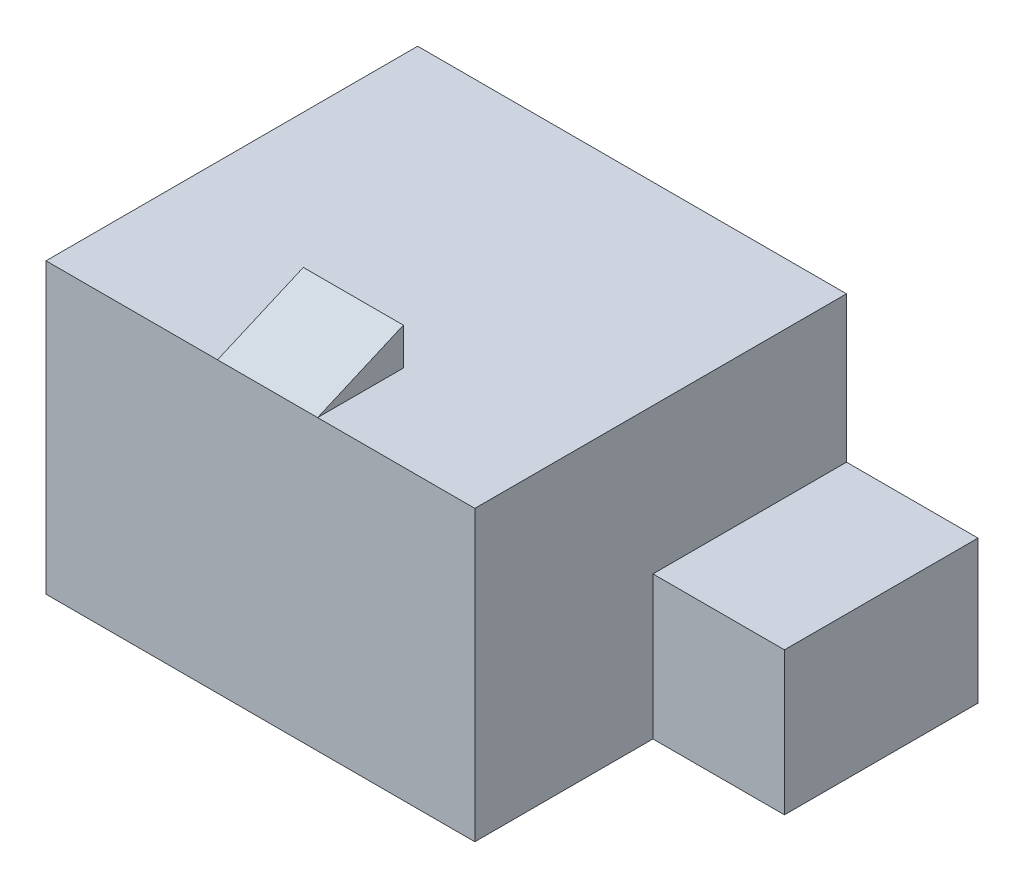
ISO-10303-21;
HEADER;
FILE_DESCRIPTION(('STEP AP214'),'2;1');
FILE_NAME('part.step','',(''),(''),'','','');
FILE_SCHEMA(('AUTOMOTIVE_DESIGN { 1 0 10303 214 1 1 1 1 }'));
ENDSEC;
DATA;
#1=APPLICATION_CONTEXT('core data for automotive mechanical design processes');
#2=APPLICATION_PROTOCOL_DEFINITION('international standard','automotive_design',2000,#1);
#3=PRODUCT_CONTEXT('',#1,'mechanical');
#4=PRODUCT('Part','Part','',(#3));
#5=PRODUCT_RELATED_PRODUCT_CATEGORY('part','',(#4));
#6=PRODUCT_DEFINITION_FORMATION('','',#4);
#7=PRODUCT_DEFINITION_CONTEXT('part definition',#1,'design');
#8=PRODUCT_DEFINITION('design','',#6,#7);
#9=PRODUCT_DEFINITION_SHAPE('','',#8);
#10=(LENGTH_UNIT() NAMED_UNIT(*) SI_UNIT(.MILLI.,.METRE.));
#11=(NAMED_UNIT(*) PLANE_ANGLE_UNIT() SI_UNIT($,.RADIAN.));
#12=(NAMED_UNIT(*) SI_UNIT($,.STERADIAN.) SOLID_ANGLE_UNIT());
#13=UNCERTAINTY_MEASURE_WITH_UNIT(LENGTH_MEASURE(1.E-05),#10,'distance_accuracy_value','');
#14=(GEOMETRIC_REPRESENTATION_CONTEXT(3) GLOBAL_UNCERTAINTY_ASSIGNED_CONTEXT((#13)) GLOBAL_UNIT_ASSIGNED_CONTEXT((#10,
#11,#12)) REPRESENTATION_CONTEXT('',''));
#15=CARTESIAN_POINT('',(0.,0.,0.));
#16=DIRECTION('',(0.,0.,1.));
#17=DIRECTION('',(1.,0.,0.));
#18=AXIS2_PLACEMENT_3D('',#15,#16,#17);
#19=CARTESIAN_POINT('',(0.,10.1,0.));
#20=DIRECTION('',(1.,0.,0.));
#21=DIRECTION('',(0.,0.,-1.));
#22=AXIS2_PLACEMENT_3D('',#19,#20,#21);
#23=PLANE('',#22);
#24=DIRECTION('',(0.,0.,-1.));
#25=VECTOR('',#24,1.);
#26=CARTESIAN_POINT('',(0.,5.,-6.23));
#27=LINE('',#26,#25);
#28=CARTESIAN_POINT('',(0.,5.,-6.23));
#29=VERTEX_POINT('',#28);
#30=CARTESIAN_POINT('',(0.,5.,-13.));
#31=VERTEX_POINT('',#30);
#32=EDGE_CURVE('E157',#29,#31,#27,.T.);
#33=ORIENTED_EDGE('',*,*,#32,.F.);
#34=DIRECTION('',(0.,1.,0.));
#35=VECTOR('',#34,1.);
#36=CARTESIAN_POINT('',(0.,5.,-6.23));
#37=LINE('',#36,#35);
#38=CARTESIAN_POINT('',(0.,0.,-6.23));
#39=VERTEX_POINT('',#38);
#40=EDGE_CURVE('E55',#39,#29,#37,.T.);
#41=ORIENTED_EDGE('',*,*,#40,.F.);
#42=DIRECTION('',(0.,0.,1.));
#43=VECTOR('',#42,1.);
#44=CARTESIAN_POINT('',(0.,0.,0.));
#45=LINE('',#44,#43);
#46=CARTESIAN_POINT('',(0.,0.,0.));
#47=VERTEX_POINT('',#46);
#48=EDGE_CURVE('E187',#39,#47,#45,.T.);
#49=ORIENTED_EDGE('',*,*,#48,.T.);
#50=DIRECTION('',(0.,-1.,0.));
#51=VECTOR('',#50,1.);
#52=CARTESIAN_POINT('',(0.,10.1,0.));
#53=LINE('',#52,#51);
#54=CARTESIAN_POINT('',(0.,10.1,0.));
#55=VERTEX_POINT('',#54);
#56=EDGE_CURVE('E11',#55,#47,#53,.T.);
#57=ORIENTED_EDGE('',*,*,#56,.F.);
#58=DIRECTION('',(0.,0.,1.));
#59=VECTOR('',#58,1.);
#60=CARTESIAN_POINT('',(0.,10.1,0.));
#61=LINE('',#60,#59);
#62=CARTESIAN_POINT('',(0.,10.1,-13.));
#63=VERTEX_POINT('',#62);
#64=EDGE_CURVE('E141',#63,#55,#61,.T.);
#65=ORIENTED_EDGE('',*,*,#64,.F.);
#66=DIRECTION('',(0.,-1.,0.));
#67=VECTOR('',#66,1.);
#68=CARTESIAN_POINT('',(0.,10.1,-13.));
#69=LINE('',#68,#67);
#70=EDGE_CURVE('E49',#63,#31,#69,.T.);
#71=ORIENTED_EDGE('',*,*,#70,.T.);
#72=EDGE_LOOP('',(#33,#41,#49,#57,#65,#71));
#73=FACE_BOUND('',#72,.T.);
#74=ADVANCED_FACE('F33',(#73),#23,.F.);
#75=CARTESIAN_POINT('',(15.,10.1,0.));
#76=DIRECTION('',(-1.,0.,0.));
#77=DIRECTION('',(0.,0.,1.));
#78=AXIS2_PLACEMENT_3D('',#75,#76,#77);
#79=PLANE('',#78);
#80=DIRECTION('',(0.,-1.,0.));
#81=VECTOR('',#80,1.);
#82=CARTESIAN_POINT('',(15.,0.,-6.23));
#83=LINE('',#82,#81);
#84=CARTESIAN_POINT('',(15.,5.,-6.23));
#85=VERTEX_POINT('',#84);
#86=CARTESIAN_POINT('',(15.,0.,-6.23));
#87=VERTEX_POINT('',#86);
#88=EDGE_CURVE('E177',#85,#87,#83,.T.);
#89=ORIENTED_EDGE('',*,*,#88,.F.);
#90=DIRECTION('',(0.,0.,1.));
#91=VECTOR('',#90,1.);
#92=CARTESIAN_POINT('',(15.,5.,-13.));
#93=LINE('',#92,#91);
#94=CARTESIAN_POINT('',(15.,5.,-13.));
#95=VERTEX_POINT('',#94);
#96=EDGE_CURVE('E174',#95,#85,#93,.T.);
#97=ORIENTED_EDGE('',*,*,#96,.F.);
#98=DIRECTION('',(0.,-1.,0.));
#99=VECTOR('',#98,1.);
#100=CARTESIAN_POINT('',(15.,10.1,-13.));
#101=LINE('',#100,#99);
#102=CARTESIAN_POINT('',(15.,10.1,-13.));
#103=VERTEX_POINT('',#102);
#104=EDGE_CURVE('E185',#103,#95,#101,.T.);
#105=ORIENTED_EDGE('',*,*,#104,.F.);
#106=DIRECTION('',(0.,0.,-1.));
#107=VECTOR('',#106,1.);
#108=CARTESIAN_POINT('',(15.,10.1,0.));
#109=LINE('',#108,#107);
#110=CARTESIAN_POINT('',(15.,10.1,0.));
#111=VERTEX_POINT('',#110);
#112=EDGE_CURVE('E270',#111,#103,#109,.T.);
#113=ORIENTED_EDGE('',*,*,#112,.F.);
#114=DIRECTION('',(0.,-1.,0.));
#115=VECTOR('',#114,1.);
#116=CARTESIAN_POINT('',(15.,10.1,0.));
#117=LINE('',#116,#115);
#118=CARTESIAN_POINT('',(15.,0.,0.));
#119=VERTEX_POINT('',#118);
#120=EDGE_CURVE('E41',#111,#119,#117,.T.);
#121=ORIENTED_EDGE('',*,*,#120,.T.);
#122=DIRECTION('',(0.,0.,-1.));
#123=VECTOR('',#122,1.);
#124=CARTESIAN_POINT('',(15.,0.,0.));
#125=LINE('',#124,#123);
#126=EDGE_CURVE('E142',#119,#87,#125,.T.);
#127=ORIENTED_EDGE('',*,*,#126,.T.);
#128=EDGE_LOOP('',(#89,#97,#105,#113,#121,#127));
#129=FACE_BOUND('',#128,.T.);
#130=ADVANCED_FACE('F290',(#129),#79,.F.);
#131=CARTESIAN_POINT('',(0.,10.1,0.));
#132=DIRECTION('',(0.,-1.,0.));
#133=DIRECTION('',(0.,0.,-1.));
#134=AXIS2_PLACEMENT_3D('',#131,#132,#133);
#135=PLANE('',#134);
#136=DIRECTION('',(0.,0.,1.));
#137=VECTOR('',#136,1.);
#138=CARTESIAN_POINT('',(6.,10.1,-3.));
#139=LINE('',#138,#137);
#140=CARTESIAN_POINT('',(6.,10.1,-3.));
#141=VERTEX_POINT('',#140);
#142=CARTESIAN_POINT('',(6.,10.1,0.));
#143=VERTEX_POINT('',#142);
#144=EDGE_CURVE('E226',#141,#143,#139,.T.);
#145=ORIENTED_EDGE('',*,*,#144,.F.);
#146=DIRECTION('',(-1.,0.,0.));
#147=VECTOR('',#146,1.);
#148=CARTESIAN_POINT('',(6.,10.1,-3.));
#149=LINE('',#148,#147);
#150=CARTESIAN_POINT('',(9.5,10.1,-3.));
#151=VERTEX_POINT('',#150);
#152=EDGE_CURVE('E232',#151,#141,#149,.T.);
#153=ORIENTED_EDGE('',*,*,#152,.F.);
#154=DIRECTION('',(0.,0.,-1.));
#155=VECTOR('',#154,1.);
#156=CARTESIAN_POINT('',(9.5,10.1,-3.));
#157=LINE('',#156,#155);
#158=CARTESIAN_POINT('',(9.5,10.1,0.));
#159=VERTEX_POINT('',#158);
#160=EDGE_CURVE('E240',#159,#151,#157,.T.);
#161=ORIENTED_EDGE('',*,*,#160,.F.);
#162=DIRECTION('',(1.,0.,0.));
#163=VECTOR('',#162,1.);
#164=CARTESIAN_POINT('',(0.,10.1,0.));
#165=LINE('',#164,#163);
#166=EDGE_CURVE('E267',#159,#111,#165,.T.);
#167=ORIENTED_EDGE('',*,*,#166,.T.);
#168=ORIENTED_EDGE('',*,*,#112,.T.);
#169=DIRECTION('',(-1.,0.,0.));
#170=VECTOR('',#169,1.);
#171=CARTESIAN_POINT('',(0.,10.1,-13.));
#172=LINE('',#171,#170);
#173=EDGE_CURVE('E186',#103,#63,#172,.T.);
#174=ORIENTED_EDGE('',*,*,#173,.T.);
#175=ORIENTED_EDGE('',*,*,#64,.T.);
#176=EDGE_CURVE('E275',#55,#143,#165,.T.);
#177=ORIENTED_EDGE('',*,*,#176,.T.);
#178=EDGE_LOOP('',(#145,#153,#161,#167,#168,#174,#175,#177));
#179=FACE_BOUND('',#178,.T.);
#180=ADVANCED_FACE('F280',(#179),#135,.F.);
#181=CARTESIAN_POINT('',(0.,10.1,0.));
#182=DIRECTION('',(0.,0.,-1.));
#183=DIRECTION('',(-1.,0.,0.));
#184=AXIS2_PLACEMENT_3D('',#181,#182,#183);
#185=PLANE('',#184);
#186=ORIENTED_EDGE('',*,*,#166,.F.);
#187=DIRECTION('',(1.,0.,0.));
#188=VECTOR('',#187,1.);
#189=CARTESIAN_POINT('',(-0.00102499999999998,10.1,0.));
#190=LINE('',#189,#188);
#191=EDGE_CURVE('E222',#143,#159,#190,.T.);
#192=ORIENTED_EDGE('',*,*,#191,.F.);
#193=ORIENTED_EDGE('',*,*,#176,.F.);
#194=ORIENTED_EDGE('',*,*,#56,.T.);
#195=DIRECTION('',(1.,0.,0.));
#196=VECTOR('',#195,1.);
#197=CARTESIAN_POINT('',(0.,0.,0.));
#198=LINE('',#197,#196);
#199=EDGE_CURVE('E287',#47,#119,#198,.T.);
#200=ORIENTED_EDGE('',*,*,#199,.T.);
#201=ORIENTED_EDGE('',*,*,#120,.F.);
#202=EDGE_LOOP('',(#186,#192,#193,#194,#200,#201));
#203=FACE_BOUND('',#202,.T.);
#204=ADVANCED_FACE('F285',(#203),#185,.F.);
#205=CARTESIAN_POINT('',(0.,10.1,-13.));
#206=DIRECTION('',(0.,0.,1.));
#207=DIRECTION('',(1.,0.,0.));
#208=AXIS2_PLACEMENT_3D('',#205,#206,#207);
#209=PLANE('',#208);
#210=DIRECTION('',(-1.,0.,0.));
#211=VECTOR('',#210,1.);
#212=CARTESIAN_POINT('',(0.,0.,-13.));
#213=LINE('',#212,#211);
#214=CARTESIAN_POINT('',(19.6,0.,-13.));
#215=VERTEX_POINT('',#214);
#216=CARTESIAN_POINT('',(-4.6,0.,-13.));
#217=VERTEX_POINT('',#216);
#218=EDGE_CURVE('E129',#215,#217,#213,.T.);
#219=ORIENTED_EDGE('',*,*,#218,.T.);
#220=DIRECTION('',(0.,-1.,0.));
#221=VECTOR('',#220,1.);
#222=CARTESIAN_POINT('',(-4.6,5.,-13.));
#223=LINE('',#222,#221);
#224=CARTESIAN_POINT('',(-4.6,5.,-13.));
#225=VERTEX_POINT('',#224);
#226=EDGE_CURVE('E134',#225,#217,#223,.T.);
#227=ORIENTED_EDGE('',*,*,#226,.F.);
#228=DIRECTION('',(1.,0.,0.));
#229=VECTOR('',#228,1.);
#230=CARTESIAN_POINT('',(-4.6,5.,-13.));
#231=LINE('',#230,#229);
#232=EDGE_CURVE('E163',#225,#31,#231,.T.);
#233=ORIENTED_EDGE('',*,*,#232,.T.);
#234=ORIENTED_EDGE('',*,*,#70,.F.);
#235=ORIENTED_EDGE('',*,*,#173,.F.);
#236=ORIENTED_EDGE('',*,*,#104,.T.);
#237=DIRECTION('',(-1.,0.,0.));
#238=VECTOR('',#237,1.);
#239=CARTESIAN_POINT('',(19.6,5.,-13.));
#240=LINE('',#239,#238);
#241=CARTESIAN_POINT('',(19.6,5.,-13.));
#242=VERTEX_POINT('',#241);
#243=EDGE_CURVE('E202',#242,#95,#240,.T.);
#244=ORIENTED_EDGE('',*,*,#243,.F.);
#245=DIRECTION('',(0.,1.,0.));
#246=VECTOR('',#245,1.);
#247=CARTESIAN_POINT('',(19.6,0.,-13.));
#248=LINE('',#247,#246);
#249=EDGE_CURVE('E137',#215,#242,#248,.T.);
#250=ORIENTED_EDGE('',*,*,#249,.F.);
#251=EDGE_LOOP('',(#219,#227,#233,#234,#235,#236,#244,#250));
#252=FACE_BOUND('',#251,.T.);
#253=ADVANCED_FACE('F131',(#252),#209,.F.);
#254=CARTESIAN_POINT('',(0.,0.,0.));
#255=DIRECTION('',(0.,-1.,0.));
#256=DIRECTION('',(0.,0.,-1.));
#257=AXIS2_PLACEMENT_3D('',#254,#255,#256);
#258=PLANE('',#257);
#259=ORIENTED_EDGE('',*,*,#48,.F.);
#260=DIRECTION('',(1.,0.,0.));
#261=VECTOR('',#260,1.);
#262=CARTESIAN_POINT('',(-4.6,0.,-6.23));
#263=LINE('',#262,#261);
#264=CARTESIAN_POINT('',(-4.6,0.,-6.23));
#265=VERTEX_POINT('',#264);
#266=EDGE_CURVE('E148',#265,#39,#263,.T.);
#267=ORIENTED_EDGE('',*,*,#266,.F.);
#268=DIRECTION('',(0.,0.,1.));
#269=VECTOR('',#268,1.);
#270=CARTESIAN_POINT('',(-4.6,0.,-6.23));
#271=LINE('',#270,#269);
#272=EDGE_CURVE('E145',#217,#265,#271,.T.);
#273=ORIENTED_EDGE('',*,*,#272,.F.);
#274=ORIENTED_EDGE('',*,*,#218,.F.);
#275=DIRECTION('',(0.,0.,-1.));
#276=VECTOR('',#275,1.);
#277=CARTESIAN_POINT('',(19.6,0.,-13.));
#278=LINE('',#277,#276);
#279=CARTESIAN_POINT('',(19.6,0.,-6.23));
#280=VERTEX_POINT('',#279);
#281=EDGE_CURVE('E216',#280,#215,#278,.T.);
#282=ORIENTED_EDGE('',*,*,#281,.F.);
#283=DIRECTION('',(-1.,0.,0.));
#284=VECTOR('',#283,1.);
#285=CARTESIAN_POINT('',(19.6,0.,-6.23));
#286=LINE('',#285,#284);
#287=EDGE_CURVE('E212',#280,#87,#286,.T.);
#288=ORIENTED_EDGE('',*,*,#287,.T.);
#289=ORIENTED_EDGE('',*,*,#126,.F.);
#290=ORIENTED_EDGE('',*,*,#199,.F.);
#291=EDGE_LOOP('',(#259,#267,#273,#274,#282,#288,#289,#290));
#292=FACE_BOUND('',#291,.T.);
#293=ADVANCED_FACE('F146',(#292),#258,.T.);
#294=CARTESIAN_POINT('',(6.,11.4,-3.));
#295=DIRECTION('',(1.,0.,0.));
#296=DIRECTION('',(0.,0.,-1.));
#297=AXIS2_PLACEMENT_3D('',#294,#295,#296);
#298=PLANE('',#297);
#299=ORIENTED_EDGE('',*,*,#144,.T.);
#300=DIRECTION('',(0.,-0.397607437634301,0.917555625309924));
#301=VECTOR('',#300,1.);
#302=CARTESIAN_POINT('',(6.,10.1,0.));
#303=LINE('',#302,#301);
#304=CARTESIAN_POINT('',(6.,11.4,-3.));
#305=VERTEX_POINT('',#304);
#306=EDGE_CURVE('E224',#305,#143,#303,.T.);
#307=ORIENTED_EDGE('',*,*,#306,.F.);
#308=DIRECTION('',(0.,-1.,0.));
#309=VECTOR('',#308,1.);
#310=CARTESIAN_POINT('',(6.,11.4,-3.));
#311=LINE('',#310,#309);
#312=EDGE_CURVE('E231',#305,#141,#311,.T.);
#313=ORIENTED_EDGE('',*,*,#312,.T.);
#314=EDGE_LOOP('',(#299,#307,#313));
#315=FACE_BOUND('',#314,.T.);
#316=ADVANCED_FACE('F341',(#315),#298,.F.);
#317=CARTESIAN_POINT('',(9.5,11.4,-3.));
#318=DIRECTION('',(-1.,0.,0.));
#319=DIRECTION('',(0.,0.,1.));
#320=AXIS2_PLACEMENT_3D('',#317,#318,#319);
#321=PLANE('',#320);
#322=DIRECTION('',(0.,-1.,0.));
#323=VECTOR('',#322,1.);
#324=CARTESIAN_POINT('',(9.5,11.4,-3.));
#325=LINE('',#324,#323);
#326=CARTESIAN_POINT('',(9.5,11.4,-3.));
#327=VERTEX_POINT('',#326);
#328=EDGE_CURVE('E255',#327,#151,#325,.T.);
#329=ORIENTED_EDGE('',*,*,#328,.F.);
#330=DIRECTION('',(0.,0.397607437634301,-0.917555625309924));
#331=VECTOR('',#330,1.);
#332=CARTESIAN_POINT('',(9.5,10.1,0.));
#333=LINE('',#332,#331);
#334=EDGE_CURVE('E205',#159,#327,#333,.T.);
#335=ORIENTED_EDGE('',*,*,#334,.F.);
#336=ORIENTED_EDGE('',*,*,#160,.T.);
#337=EDGE_LOOP('',(#329,#335,#336));
#338=FACE_BOUND('',#337,.T.);
#339=ADVANCED_FACE('F256',(#338),#321,.F.);
#340=CARTESIAN_POINT('',(6.,11.4,-3.));
#341=DIRECTION('',(0.,0.,1.));
#342=DIRECTION('',(1.,0.,0.));
#343=AXIS2_PLACEMENT_3D('',#340,#341,#342);
#344=PLANE('',#343);
#345=ORIENTED_EDGE('',*,*,#152,.T.);
#346=ORIENTED_EDGE('',*,*,#312,.F.);
#347=DIRECTION('',(-1.,0.,0.));
#348=VECTOR('',#347,1.);
#349=CARTESIAN_POINT('',(6.,11.4,-3.));
#350=LINE('',#349,#348);
#351=EDGE_CURVE('E229',#327,#305,#350,.T.);
#352=ORIENTED_EDGE('',*,*,#351,.F.);
#353=ORIENTED_EDGE('',*,*,#328,.T.);
#354=EDGE_LOOP('',(#345,#346,#352,#353));
#355=FACE_BOUND('',#354,.T.);
#356=ADVANCED_FACE('F261',(#355),#344,.F.);
#357=CARTESIAN_POINT('',(-0.00102499999999998,10.1,0.));
#358=DIRECTION('',(0.,-0.917555625309924,-0.397607437634301));
#359=DIRECTION('',(0.,0.397607437634301,-0.917555625309924));
#360=AXIS2_PLACEMENT_3D('',#357,#358,#359);
#361=PLANE('',#360);
#362=ORIENTED_EDGE('',*,*,#306,.T.);
#363=ORIENTED_EDGE('',*,*,#191,.T.);
#364=ORIENTED_EDGE('',*,*,#334,.T.);
#365=ORIENTED_EDGE('',*,*,#351,.T.);
#366=EDGE_LOOP('',(#362,#363,#364,#365));
#367=FACE_BOUND('',#366,.T.);
#368=ADVANCED_FACE('F247',(#367),#361,.F.);
#369=CARTESIAN_POINT('',(19.6,5.,-13.));
#370=DIRECTION('',(0.,-1.,0.));
#371=DIRECTION('',(0.,0.,-1.));
#372=AXIS2_PLACEMENT_3D('',#369,#370,#371);
#373=PLANE('',#372);
#374=ORIENTED_EDGE('',*,*,#96,.T.);
#375=DIRECTION('',(-1.,0.,0.));
#376=VECTOR('',#375,1.);
#377=CARTESIAN_POINT('',(19.6,5.,-6.23));
#378=LINE('',#377,#376);
#379=CARTESIAN_POINT('',(19.6,5.,-6.23));
#380=VERTEX_POINT('',#379);
#381=EDGE_CURVE('E206',#380,#85,#378,.T.);
#382=ORIENTED_EDGE('',*,*,#381,.F.);
#383=DIRECTION('',(0.,0.,1.));
#384=VECTOR('',#383,1.);
#385=CARTESIAN_POINT('',(19.6,5.,-13.));
#386=LINE('',#385,#384);
#387=EDGE_CURVE('E305',#242,#380,#386,.T.);
#388=ORIENTED_EDGE('',*,*,#387,.F.);
#389=ORIENTED_EDGE('',*,*,#243,.T.);
#390=EDGE_LOOP('',(#374,#382,#388,#389));
#391=FACE_BOUND('',#390,.T.);
#392=ADVANCED_FACE('F304',(#391),#373,.F.);
#393=CARTESIAN_POINT('',(19.6,0.,-6.23));
#394=DIRECTION('',(0.,0.,-1.));
#395=DIRECTION('',(-1.,0.,0.));
#396=AXIS2_PLACEMENT_3D('',#393,#394,#395);
#397=PLANE('',#396);
#398=ORIENTED_EDGE('',*,*,#88,.T.);
#399=ORIENTED_EDGE('',*,*,#287,.F.);
#400=DIRECTION('',(0.,-1.,0.));
#401=VECTOR('',#400,1.);
#402=CARTESIAN_POINT('',(19.6,0.,-6.23));
#403=LINE('',#402,#401);
#404=EDGE_CURVE('E302',#380,#280,#403,.T.);
#405=ORIENTED_EDGE('',*,*,#404,.F.);
#406=ORIENTED_EDGE('',*,*,#381,.T.);
#407=EDGE_LOOP('',(#398,#399,#405,#406));
#408=FACE_BOUND('',#407,.T.);
#409=ADVANCED_FACE('F299',(#408),#397,.F.);
#410=CARTESIAN_POINT('',(19.6,0.,0.));
#411=DIRECTION('',(1.,0.,0.));
#412=DIRECTION('',(0.,0.,-1.));
#413=AXIS2_PLACEMENT_3D('',#410,#411,#412);
#414=PLANE('',#413);
#415=ORIENTED_EDGE('',*,*,#249,.T.);
#416=ORIENTED_EDGE('',*,*,#387,.T.);
#417=ORIENTED_EDGE('',*,*,#404,.T.);
#418=ORIENTED_EDGE('',*,*,#281,.T.);
#419=EDGE_LOOP('',(#415,#416,#417,#418));
#420=FACE_BOUND('',#419,.T.);
#421=ADVANCED_FACE('F308',(#420),#414,.T.);
#422=CARTESIAN_POINT('',(-4.6,5.,-6.23));
#423=DIRECTION('',(0.,0.,-1.));
#424=DIRECTION('',(-1.,0.,0.));
#425=AXIS2_PLACEMENT_3D('',#422,#423,#424);
#426=PLANE('',#425);
#427=ORIENTED_EDGE('',*,*,#40,.T.);
#428=DIRECTION('',(1.,0.,0.));
#429=VECTOR('',#428,1.);
#430=CARTESIAN_POINT('',(-4.6,5.,-6.23));
#431=LINE('',#430,#429);
#432=CARTESIAN_POINT('',(-4.6,5.,-6.23));
#433=VERTEX_POINT('',#432);
#434=EDGE_CURVE('E166',#433,#29,#431,.T.);
#435=ORIENTED_EDGE('',*,*,#434,.F.);
#436=DIRECTION('',(0.,1.,0.));
#437=VECTOR('',#436,1.);
#438=CARTESIAN_POINT('',(-4.6,5.,-6.23));
#439=LINE('',#438,#437);
#440=EDGE_CURVE('E151',#265,#433,#439,.T.);
#441=ORIENTED_EDGE('',*,*,#440,.F.);
#442=ORIENTED_EDGE('',*,*,#266,.T.);
#443=EDGE_LOOP('',(#427,#435,#441,#442));
#444=FACE_BOUND('',#443,.T.);
#445=ADVANCED_FACE('F310',(#444),#426,.F.);
#446=CARTESIAN_POINT('',(-4.6,5.,-6.23));
#447=DIRECTION('',(0.,-1.,0.));
#448=DIRECTION('',(0.,0.,-1.));
#449=AXIS2_PLACEMENT_3D('',#446,#447,#448);
#450=PLANE('',#449);
#451=ORIENTED_EDGE('',*,*,#32,.T.);
#452=ORIENTED_EDGE('',*,*,#232,.F.);
#453=DIRECTION('',(0.,0.,-1.));
#454=VECTOR('',#453,1.);
#455=CARTESIAN_POINT('',(-4.6,5.,-6.23));
#456=LINE('',#455,#454);
#457=EDGE_CURVE('E155',#433,#225,#456,.T.);
#458=ORIENTED_EDGE('',*,*,#457,.F.);
#459=ORIENTED_EDGE('',*,*,#434,.T.);
#460=EDGE_LOOP('',(#451,#452,#458,#459));
#461=FACE_BOUND('',#460,.T.);
#462=ADVANCED_FACE('F316',(#461),#450,.F.);
#463=CARTESIAN_POINT('',(-4.6,0.,0.));
#464=DIRECTION('',(1.,0.,0.));
#465=DIRECTION('',(0.,0.,-1.));
#466=AXIS2_PLACEMENT_3D('',#463,#464,#465);
#467=PLANE('',#466);
#468=ORIENTED_EDGE('',*,*,#226,.T.);
#469=ORIENTED_EDGE('',*,*,#272,.T.);
#470=ORIENTED_EDGE('',*,*,#440,.T.);
#471=ORIENTED_EDGE('',*,*,#457,.T.);
#472=EDGE_LOOP('',(#468,#469,#470,#471));
#473=FACE_BOUND('',#472,.T.);
#474=ADVANCED_FACE('F153',(#473),#467,.F.);
#475=CLOSED_SHELL('',(#74,#130,#180,#204,#253,#293,#316,#339,#356,#368,#392,#409,#421,#445,#462,#474));
#476=MANIFOLD_SOLID_BREP('B2',#475);
#477=ADVANCED_BREP_SHAPE_REPRESENTATION('',(#18,#476),#14);
#478=SHAPE_DEFINITION_REPRESENTATION(#9,#477);
ENDSEC;
END-ISO-10303-21;
